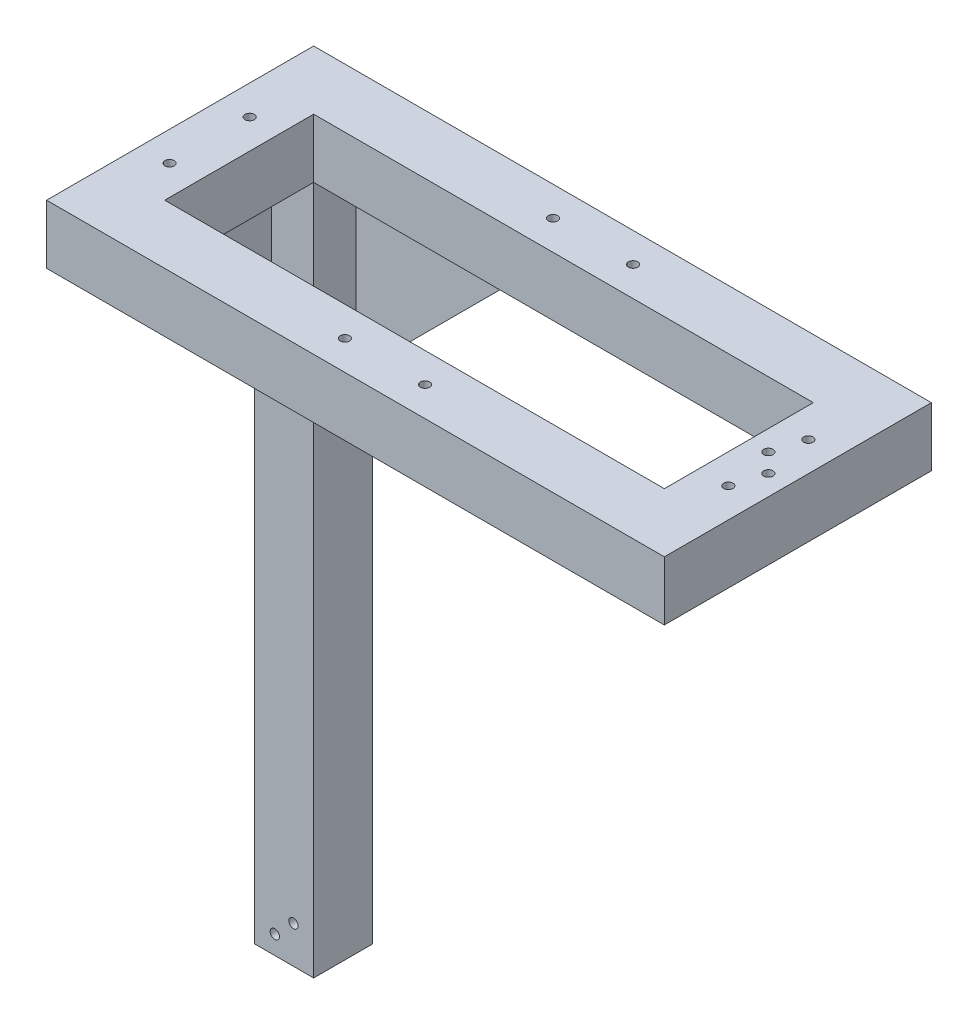
ISO-10303-21;
HEADER;
FILE_DESCRIPTION(('STEP AP214'),'2;1');
FILE_NAME('part.step','',(''),(''),'','','');
FILE_SCHEMA(('AUTOMOTIVE_DESIGN { 1 0 10303 214 1 1 1 1 }'));
ENDSEC;
DATA;
#1=APPLICATION_CONTEXT('core data for automotive mechanical design processes');
#2=APPLICATION_PROTOCOL_DEFINITION('international standard','automotive_design',2000,#1);
#3=PRODUCT_CONTEXT('',#1,'mechanical');
#4=PRODUCT('Part','Part','',(#3));
#5=PRODUCT_RELATED_PRODUCT_CATEGORY('part','',(#4));
#6=PRODUCT_DEFINITION_FORMATION('','',#4);
#7=PRODUCT_DEFINITION_CONTEXT('part definition',#1,'design');
#8=PRODUCT_DEFINITION('design','',#6,#7);
#9=PRODUCT_DEFINITION_SHAPE('','',#8);
#10=(LENGTH_UNIT() NAMED_UNIT(*) SI_UNIT(.MILLI.,.METRE.));
#11=(NAMED_UNIT(*) PLANE_ANGLE_UNIT() SI_UNIT($,.RADIAN.));
#12=(NAMED_UNIT(*) SI_UNIT($,.STERADIAN.) SOLID_ANGLE_UNIT());
#13=UNCERTAINTY_MEASURE_WITH_UNIT(LENGTH_MEASURE(1.E-05),#10,'distance_accuracy_value','');
#14=(GEOMETRIC_REPRESENTATION_CONTEXT(3) GLOBAL_UNCERTAINTY_ASSIGNED_CONTEXT((#13)) GLOBAL_UNIT_ASSIGNED_CONTEXT((#10,
#11,#12)) REPRESENTATION_CONTEXT('',''));
#15=CARTESIAN_POINT('',(0.,0.,0.));
#16=DIRECTION('',(0.,0.,1.));
#17=DIRECTION('',(1.,0.,0.));
#18=AXIS2_PLACEMENT_3D('',#15,#16,#17);
#19=CARTESIAN_POINT('',(-134.15,-100.,-62.7));
#20=DIRECTION('',(-1.,0.,0.));
#21=DIRECTION('',(0.,0.,1.));
#22=AXIS2_PLACEMENT_3D('',#19,#20,#21);
#23=PLANE('',#22);
#24=DIRECTION('',(0.,1.,0.));
#25=VECTOR('',#24,1.);
#26=CARTESIAN_POINT('',(-134.15,-100.,-66.7));
#27=LINE('',#26,#25);
#28=CARTESIAN_POINT('',(-134.15,-100.,-66.7));
#29=VERTEX_POINT('',#28);
#30=CARTESIAN_POINT('',(-134.15,0.,-66.7));
#31=VERTEX_POINT('',#30);
#32=EDGE_CURVE('E96',#29,#31,#27,.T.);
#33=ORIENTED_EDGE('',*,*,#32,.F.);
#34=DIRECTION('',(0.,0.,-1.));
#35=VECTOR('',#34,1.);
#36=CARTESIAN_POINT('',(-134.15,-100.,-62.7));
#37=LINE('',#36,#35);
#38=CARTESIAN_POINT('',(-134.15,-100.,-62.7));
#39=VERTEX_POINT('',#38);
#40=EDGE_CURVE('E12',#39,#29,#37,.T.);
#41=ORIENTED_EDGE('',*,*,#40,.F.);
#42=DIRECTION('',(0.,1.,0.));
#43=VECTOR('',#42,1.);
#44=CARTESIAN_POINT('',(-134.15,-100.,-62.7));
#45=LINE('',#44,#43);
#46=CARTESIAN_POINT('',(-134.15,0.,-62.7));
#47=VERTEX_POINT('',#46);
#48=EDGE_CURVE('E88',#39,#47,#45,.T.);
#49=ORIENTED_EDGE('',*,*,#48,.T.);
#50=DIRECTION('',(0.,0.,-1.));
#51=VECTOR('',#50,1.);
#52=CARTESIAN_POINT('',(-134.15,0.,-62.7));
#53=LINE('',#52,#51);
#54=EDGE_CURVE('E47',#47,#31,#53,.T.);
#55=ORIENTED_EDGE('',*,*,#54,.T.);
#56=EDGE_LOOP('',(#33,#41,#49,#55));
#57=FACE_BOUND('',#56,.T.);
#58=ADVANCED_FACE('F44',(#57),#23,.T.);
#59=CARTESIAN_POINT('',(-34.15,0.,-62.7));
#60=DIRECTION('',(0.707106781186547,-0.707106781186547,0.));
#61=DIRECTION('',(0.707106781186548,0.707106781186548,0.));
#62=AXIS2_PLACEMENT_3D('',#59,#60,#61);
#63=PLANE('',#62);
#64=DIRECTION('',(-0.707106781186547,-0.707106781186547,0.));
#65=VECTOR('',#64,1.);
#66=CARTESIAN_POINT('',(-34.15,0.,-66.7));
#67=LINE('',#66,#65);
#68=CARTESIAN_POINT('',(-34.15,0.,-66.7));
#69=VERTEX_POINT('',#68);
#70=EDGE_CURVE('E90',#69,#29,#67,.T.);
#71=ORIENTED_EDGE('',*,*,#70,.F.);
#72=DIRECTION('',(0.,0.,-1.));
#73=VECTOR('',#72,1.);
#74=CARTESIAN_POINT('',(-34.15,0.,-62.7));
#75=LINE('',#74,#73);
#76=CARTESIAN_POINT('',(-34.15,0.,-62.7));
#77=VERTEX_POINT('',#76);
#78=EDGE_CURVE('E53',#77,#69,#75,.T.);
#79=ORIENTED_EDGE('',*,*,#78,.F.);
#80=DIRECTION('',(-0.707106781186547,-0.707106781186547,0.));
#81=VECTOR('',#80,1.);
#82=CARTESIAN_POINT('',(-34.15,0.,-62.7));
#83=LINE('',#82,#81);
#84=EDGE_CURVE('E85',#77,#39,#83,.T.);
#85=ORIENTED_EDGE('',*,*,#84,.T.);
#86=ORIENTED_EDGE('',*,*,#40,.T.);
#87=EDGE_LOOP('',(#71,#79,#85,#86));
#88=FACE_BOUND('',#87,.T.);
#89=ADVANCED_FACE('F100',(#88),#63,.T.);
#90=CARTESIAN_POINT('',(-134.15,0.,-62.7));
#91=DIRECTION('',(0.,1.,0.));
#92=DIRECTION('',(0.,0.,1.));
#93=AXIS2_PLACEMENT_3D('',#90,#91,#92);
#94=PLANE('',#93);
#95=DIRECTION('',(1.,0.,0.));
#96=VECTOR('',#95,1.);
#97=CARTESIAN_POINT('',(-134.15,0.,-66.7));
#98=LINE('',#97,#96);
#99=EDGE_CURVE('E83',#31,#69,#98,.T.);
#100=ORIENTED_EDGE('',*,*,#99,.F.);
#101=ORIENTED_EDGE('',*,*,#54,.F.);
#102=DIRECTION('',(1.,0.,0.));
#103=VECTOR('',#102,1.);
#104=CARTESIAN_POINT('',(-134.15,0.,-62.7));
#105=LINE('',#104,#103);
#106=EDGE_CURVE('E81',#47,#77,#105,.T.);
#107=ORIENTED_EDGE('',*,*,#106,.T.);
#108=ORIENTED_EDGE('',*,*,#78,.T.);
#109=EDGE_LOOP('',(#100,#101,#107,#108));
#110=FACE_BOUND('',#109,.T.);
#111=ADVANCED_FACE('F80',(#110),#94,.T.);
#112=CARTESIAN_POINT('',(0.,0.,-62.7));
#113=DIRECTION('',(0.,0.,-1.));
#114=DIRECTION('',(-1.,0.,0.));
#115=AXIS2_PLACEMENT_3D('',#112,#113,#114);
#116=PLANE('',#115);
#117=ORIENTED_EDGE('',*,*,#48,.F.);
#118=ORIENTED_EDGE('',*,*,#84,.F.);
#119=ORIENTED_EDGE('',*,*,#106,.F.);
#120=EDGE_LOOP('',(#117,#118,#119));
#121=FACE_BOUND('',#120,.T.);
#122=ADVANCED_FACE('F87',(#121),#116,.F.);
#123=CARTESIAN_POINT('',(0.,0.,-66.7));
#124=DIRECTION('',(0.,0.,-1.));
#125=DIRECTION('',(-1.,0.,0.));
#126=AXIS2_PLACEMENT_3D('',#123,#124,#125);
#127=PLANE('',#126);
#128=ORIENTED_EDGE('',*,*,#32,.T.);
#129=ORIENTED_EDGE('',*,*,#99,.T.);
#130=ORIENTED_EDGE('',*,*,#70,.T.);
#131=EDGE_LOOP('',(#128,#129,#130));
#132=FACE_BOUND('',#131,.T.);
#133=ADVANCED_FACE('F99',(#132),#127,.T.);
#134=CLOSED_SHELL('',(#58,#89,#111,#122,#133));
#135=MANIFOLD_SOLID_BREP('B2',#134);
#136=CARTESIAN_POINT('',(-156.85,-100.,-40.));
#137=DIRECTION('',(0.,0.,1.));
#138=DIRECTION('',(1.,0.,0.));
#139=AXIS2_PLACEMENT_3D('',#136,#137,#138);
#140=PLANE('',#139);
#141=DIRECTION('',(0.,1.,0.));
#142=VECTOR('',#141,1.);
#143=CARTESIAN_POINT('',(-160.85,-100.,-40.));
#144=LINE('',#143,#142);
#145=CARTESIAN_POINT('',(-160.85,-100.,-40.));
#146=VERTEX_POINT('',#145);
#147=CARTESIAN_POINT('',(-160.85,0.,-40.));
#148=VERTEX_POINT('',#147);
#149=EDGE_CURVE('E198',#146,#148,#144,.T.);
#150=ORIENTED_EDGE('',*,*,#149,.T.);
#151=DIRECTION('',(-1.,0.,0.));
#152=VECTOR('',#151,1.);
#153=CARTESIAN_POINT('',(-156.85,0.,-40.));
#154=LINE('',#153,#152);
#155=CARTESIAN_POINT('',(-156.85,0.,-40.));
#156=VERTEX_POINT('',#155);
#157=EDGE_CURVE('E42',#156,#148,#154,.T.);
#158=ORIENTED_EDGE('',*,*,#157,.F.);
#159=DIRECTION('',(0.,1.,0.));
#160=VECTOR('',#159,1.);
#161=CARTESIAN_POINT('',(-156.85,-100.,-40.));
#162=LINE('',#161,#160);
#163=CARTESIAN_POINT('',(-156.85,-100.,-40.));
#164=VERTEX_POINT('',#163);
#165=EDGE_CURVE('E191',#164,#156,#162,.T.);
#166=ORIENTED_EDGE('',*,*,#165,.F.);
#167=DIRECTION('',(-1.,0.,0.));
#168=VECTOR('',#167,1.);
#169=CARTESIAN_POINT('',(-156.85,-100.,-40.));
#170=LINE('',#169,#168);
#171=EDGE_CURVE('E199',#164,#146,#170,.T.);
#172=ORIENTED_EDGE('',*,*,#171,.T.);
#173=EDGE_LOOP('',(#150,#158,#166,#172));
#174=FACE_BOUND('',#173,.T.);
#175=ADVANCED_FACE('F151',(#174),#140,.F.);
#176=CARTESIAN_POINT('',(-156.85,0.,-40.));
#177=DIRECTION('',(0.,-1.,0.));
#178=DIRECTION('',(0.,0.,-1.));
#179=AXIS2_PLACEMENT_3D('',#176,#177,#178);
#180=PLANE('',#179);
#181=DIRECTION('',(0.,0.,1.));
#182=VECTOR('',#181,1.);
#183=CARTESIAN_POINT('',(-160.85,0.,-40.));
#184=LINE('',#183,#182);
#185=CARTESIAN_POINT('',(-160.85,0.,60.));
#186=VERTEX_POINT('',#185);
#187=EDGE_CURVE('E179',#148,#186,#184,.T.);
#188=ORIENTED_EDGE('',*,*,#187,.T.);
#189=DIRECTION('',(-1.,0.,0.));
#190=VECTOR('',#189,1.);
#191=CARTESIAN_POINT('',(-156.85,0.,60.));
#192=LINE('',#191,#190);
#193=CARTESIAN_POINT('',(-156.85,0.,60.));
#194=VERTEX_POINT('',#193);
#195=EDGE_CURVE('E159',#194,#186,#192,.T.);
#196=ORIENTED_EDGE('',*,*,#195,.F.);
#197=DIRECTION('',(0.,0.,1.));
#198=VECTOR('',#197,1.);
#199=CARTESIAN_POINT('',(-156.85,0.,-40.));
#200=LINE('',#199,#198);
#201=EDGE_CURVE('E187',#156,#194,#200,.T.);
#202=ORIENTED_EDGE('',*,*,#201,.F.);
#203=ORIENTED_EDGE('',*,*,#157,.T.);
#204=EDGE_LOOP('',(#188,#196,#202,#203));
#205=FACE_BOUND('',#204,.T.);
#206=ADVANCED_FACE('F188',(#205),#180,.F.);
#207=CARTESIAN_POINT('',(-156.85,0.,60.));
#208=DIRECTION('',(0.,0.707106781186547,-0.707106781186547));
#209=DIRECTION('',(0.,0.707106781186548,0.707106781186548));
#210=AXIS2_PLACEMENT_3D('',#207,#208,#209);
#211=PLANE('',#210);
#212=DIRECTION('',(0.,-0.707106781186547,-0.707106781186547));
#213=VECTOR('',#212,1.);
#214=CARTESIAN_POINT('',(-160.85,0.,60.));
#215=LINE('',#214,#213);
#216=EDGE_CURVE('E184',#186,#146,#215,.T.);
#217=ORIENTED_EDGE('',*,*,#216,.T.);
#218=ORIENTED_EDGE('',*,*,#171,.F.);
#219=DIRECTION('',(0.,-0.707106781186547,-0.707106781186547));
#220=VECTOR('',#219,1.);
#221=CARTESIAN_POINT('',(-156.85,0.,60.));
#222=LINE('',#221,#220);
#223=EDGE_CURVE('E167',#194,#164,#222,.T.);
#224=ORIENTED_EDGE('',*,*,#223,.F.);
#225=ORIENTED_EDGE('',*,*,#195,.T.);
#226=EDGE_LOOP('',(#217,#218,#224,#225));
#227=FACE_BOUND('',#226,.T.);
#228=ADVANCED_FACE('F206',(#227),#211,.F.);
#229=CARTESIAN_POINT('',(-156.85,0.,0.));
#230=DIRECTION('',(1.,0.,0.));
#231=DIRECTION('',(0.,0.,-1.));
#232=AXIS2_PLACEMENT_3D('',#229,#230,#231);
#233=PLANE('',#232);
#234=ORIENTED_EDGE('',*,*,#165,.T.);
#235=ORIENTED_EDGE('',*,*,#201,.T.);
#236=ORIENTED_EDGE('',*,*,#223,.T.);
#237=EDGE_LOOP('',(#234,#235,#236));
#238=FACE_BOUND('',#237,.T.);
#239=ADVANCED_FACE('F194',(#238),#233,.T.);
#240=CARTESIAN_POINT('',(-160.85,0.,0.));
#241=DIRECTION('',(1.,0.,0.));
#242=DIRECTION('',(0.,0.,-1.));
#243=AXIS2_PLACEMENT_3D('',#240,#241,#242);
#244=PLANE('',#243);
#245=ORIENTED_EDGE('',*,*,#149,.F.);
#246=ORIENTED_EDGE('',*,*,#216,.F.);
#247=ORIENTED_EDGE('',*,*,#187,.F.);
#248=EDGE_LOOP('',(#245,#246,#247));
#249=FACE_BOUND('',#248,.T.);
#250=ADVANCED_FACE('F207',(#249),#244,.F.);
#251=CLOSED_SHELL('',(#175,#206,#228,#239,#250));
#252=MANIFOLD_SOLID_BREP('B6',#251);
#253=CARTESIAN_POINT('',(0.,31.7,0.));
#254=DIRECTION('',(0.,1.,0.));
#255=DIRECTION('',(0.,0.,1.));
#256=AXIS2_PLACEMENT_3D('',#253,#254,#255);
#257=PLANE('',#256);
#258=CARTESIAN_POINT('',(-150.,31.7,-21.5));
#259=DIRECTION('',(0.,1.,0.));
#260=DIRECTION('',(0.,0.,1.));
#261=AXIS2_PLACEMENT_3D('',#258,#259,#260);
#262=CIRCLE('',#261,2.5);
#263=CARTESIAN_POINT('',(-150.,31.7,-19.));
#264=VERTEX_POINT('',#263);
#265=EDGE_CURVE('E398',#264,#264,#262,.T.);
#266=ORIENTED_EDGE('',*,*,#265,.F.);
#267=EDGE_LOOP('',(#266));
#268=FACE_BOUND('',#267,.T.);
#269=CARTESIAN_POINT('',(150.,31.7,-21.5));
#270=DIRECTION('',(0.,1.,0.));
#271=DIRECTION('',(0.,0.,1.));
#272=AXIS2_PLACEMENT_3D('',#269,#270,#271);
#273=CIRCLE('',#272,2.5);
#274=CARTESIAN_POINT('',(150.,31.7,-19.));
#275=VERTEX_POINT('',#274);
#276=EDGE_CURVE('E392',#275,#275,#273,.T.);
#277=ORIENTED_EDGE('',*,*,#276,.F.);
#278=EDGE_LOOP('',(#277));
#279=FACE_BOUND('',#278,.T.);
#280=CARTESIAN_POINT('',(150.,31.7,21.5));
#281=DIRECTION('',(0.,1.,0.));
#282=DIRECTION('',(0.,0.,1.));
#283=AXIS2_PLACEMENT_3D('',#280,#281,#282);
#284=CIRCLE('',#283,2.5);
#285=CARTESIAN_POINT('',(150.,31.7,24.));
#286=VERTEX_POINT('',#285);
#287=EDGE_CURVE('E386',#286,#286,#284,.T.);
#288=ORIENTED_EDGE('',*,*,#287,.F.);
#289=EDGE_LOOP('',(#288));
#290=FACE_BOUND('',#289,.T.);
#291=CARTESIAN_POINT('',(155.,31.7,4.99999999999998));
#292=DIRECTION('',(0.,1.,0.));
#293=DIRECTION('',(0.,0.,1.));
#294=AXIS2_PLACEMENT_3D('',#291,#292,#293);
#295=CIRCLE('',#294,2.5);
#296=CARTESIAN_POINT('',(155.,31.7,7.49999999999997));
#297=VERTEX_POINT('',#296);
#298=EDGE_CURVE('E379',#297,#297,#295,.T.);
#299=ORIENTED_EDGE('',*,*,#298,.F.);
#300=EDGE_LOOP('',(#299));
#301=FACE_BOUND('',#300,.T.);
#302=CARTESIAN_POINT('',(-21.5000000000003,31.7,55.8499999999997));
#303=DIRECTION('',(0.,1.,0.));
#304=DIRECTION('',(0.,0.,1.));
#305=AXIS2_PLACEMENT_3D('',#302,#303,#304);
#306=CIRCLE('',#305,2.5);
#307=CARTESIAN_POINT('',(-21.5000000000003,31.7,58.3499999999997));
#308=VERTEX_POINT('',#307);
#309=EDGE_CURVE('E415',#308,#308,#306,.T.);
#310=ORIENTED_EDGE('',*,*,#309,.F.);
#311=EDGE_LOOP('',(#310));
#312=FACE_BOUND('',#311,.T.);
#313=CARTESIAN_POINT('',(21.4999999999997,31.7,-55.85));
#314=DIRECTION('',(0.,1.,0.));
#315=DIRECTION('',(0.,0.,1.));
#316=AXIS2_PLACEMENT_3D('',#313,#314,#315);
#317=CIRCLE('',#316,2.5);
#318=CARTESIAN_POINT('',(21.4999999999997,31.7,-53.35));
#319=VERTEX_POINT('',#318);
#320=EDGE_CURVE('E422',#319,#319,#317,.T.);
#321=ORIENTED_EDGE('',*,*,#320,.F.);
#322=EDGE_LOOP('',(#321));
#323=FACE_BOUND('',#322,.T.);
#324=CARTESIAN_POINT('',(-21.5000000000003,31.7,-55.85));
#325=DIRECTION('',(0.,1.,0.));
#326=DIRECTION('',(0.,0.,1.));
#327=AXIS2_PLACEMENT_3D('',#324,#325,#326);
#328=CIRCLE('',#327,2.5);
#329=CARTESIAN_POINT('',(-21.5000000000003,31.7,-53.35));
#330=VERTEX_POINT('',#329);
#331=EDGE_CURVE('E403',#330,#330,#328,.T.);
#332=ORIENTED_EDGE('',*,*,#331,.F.);
#333=EDGE_LOOP('',(#332));
#334=FACE_BOUND('',#333,.T.);
#335=CARTESIAN_POINT('',(145.,31.7,-5.00000000000002));
#336=DIRECTION('',(0.,1.,0.));
#337=DIRECTION('',(0.,0.,1.));
#338=AXIS2_PLACEMENT_3D('',#335,#336,#337);
#339=CIRCLE('',#338,2.5);
#340=CARTESIAN_POINT('',(145.,31.7,-2.50000000000003));
#341=VERTEX_POINT('',#340);
#342=EDGE_CURVE('E410',#341,#341,#339,.T.);
#343=ORIENTED_EDGE('',*,*,#342,.F.);
#344=EDGE_LOOP('',(#343));
#345=FACE_BOUND('',#344,.T.);
#346=CARTESIAN_POINT('',(-150.,31.7,21.5));
#347=DIRECTION('',(0.,1.,0.));
#348=DIRECTION('',(0.,0.,1.));
#349=AXIS2_PLACEMENT_3D('',#346,#347,#348);
#350=CIRCLE('',#349,2.5);
#351=CARTESIAN_POINT('',(-150.,31.7,24.));
#352=VERTEX_POINT('',#351);
#353=EDGE_CURVE('E373',#352,#352,#350,.T.);
#354=ORIENTED_EDGE('',*,*,#353,.F.);
#355=EDGE_LOOP('',(#354));
#356=FACE_BOUND('',#355,.T.);
#357=CARTESIAN_POINT('',(21.4999999999997,31.7,55.8499999999997));
#358=DIRECTION('',(0.,1.,0.));
#359=DIRECTION('',(0.,0.,1.));
#360=AXIS2_PLACEMENT_3D('',#357,#358,#359);
#361=CIRCLE('',#360,2.5);
#362=CARTESIAN_POINT('',(21.4999999999997,31.7,58.3499999999997));
#363=VERTEX_POINT('',#362);
#364=EDGE_CURVE('E427',#363,#363,#361,.T.);
#365=ORIENTED_EDGE('',*,*,#364,.F.);
#366=EDGE_LOOP('',(#365));
#367=FACE_BOUND('',#366,.T.);
#368=DIRECTION('',(0.,0.,-1.));
#369=VECTOR('',#368,1.);
#370=CARTESIAN_POINT('',(165.85,31.7,-71.7));
#371=LINE('',#370,#369);
#372=CARTESIAN_POINT('',(165.85,31.7,71.7));
#373=VERTEX_POINT('',#372);
#374=CARTESIAN_POINT('',(165.85,31.7,-71.7));
#375=VERTEX_POINT('',#374);
#376=EDGE_CURVE('E459',#373,#375,#371,.T.);
#377=ORIENTED_EDGE('',*,*,#376,.T.);
#378=DIRECTION('',(-1.,0.,0.));
#379=VECTOR('',#378,1.);
#380=CARTESIAN_POINT('',(-165.85,31.7,-71.7));
#381=LINE('',#380,#379);
#382=CARTESIAN_POINT('',(-165.85,31.7,-71.7));
#383=VERTEX_POINT('',#382);
#384=EDGE_CURVE('E462',#375,#383,#381,.T.);
#385=ORIENTED_EDGE('',*,*,#384,.T.);
#386=DIRECTION('',(0.,0.,1.));
#387=VECTOR('',#386,1.);
#388=CARTESIAN_POINT('',(-165.85,31.7,-71.7));
#389=LINE('',#388,#387);
#390=CARTESIAN_POINT('',(-165.85,31.7,71.7));
#391=VERTEX_POINT('',#390);
#392=EDGE_CURVE('E465',#383,#391,#389,.T.);
#393=ORIENTED_EDGE('',*,*,#392,.T.);
#394=DIRECTION('',(1.,0.,0.));
#395=VECTOR('',#394,1.);
#396=CARTESIAN_POINT('',(-165.85,31.7,71.7));
#397=LINE('',#396,#395);
#398=EDGE_CURVE('E467',#391,#373,#397,.T.);
#399=ORIENTED_EDGE('',*,*,#398,.T.);
#400=EDGE_LOOP('',(#377,#385,#393,#399));
#401=FACE_BOUND('',#400,.T.);
#402=DIRECTION('',(-1.,0.,0.));
#403=VECTOR('',#402,1.);
#404=CARTESIAN_POINT('',(-134.15,31.7,-40.));
#405=LINE('',#404,#403);
#406=CARTESIAN_POINT('',(134.15,31.7,-40.));
#407=VERTEX_POINT('',#406);
#408=CARTESIAN_POINT('',(-134.15,31.7,-40.));
#409=VERTEX_POINT('',#408);
#410=EDGE_CURVE('E434',#407,#409,#405,.T.);
#411=ORIENTED_EDGE('',*,*,#410,.F.);
#412=DIRECTION('',(0.,0.,-1.));
#413=VECTOR('',#412,1.);
#414=CARTESIAN_POINT('',(134.15,31.7,-40.));
#415=LINE('',#414,#413);
#416=CARTESIAN_POINT('',(134.15,31.7,40.));
#417=VERTEX_POINT('',#416);
#418=EDGE_CURVE('E432',#417,#407,#415,.T.);
#419=ORIENTED_EDGE('',*,*,#418,.F.);
#420=DIRECTION('',(1.,0.,0.));
#421=VECTOR('',#420,1.);
#422=CARTESIAN_POINT('',(-134.15,31.7,40.));
#423=LINE('',#422,#421);
#424=CARTESIAN_POINT('',(-134.15,31.7,40.));
#425=VERTEX_POINT('',#424);
#426=EDGE_CURVE('E439',#425,#417,#423,.T.);
#427=ORIENTED_EDGE('',*,*,#426,.F.);
#428=DIRECTION('',(0.,0.,1.));
#429=VECTOR('',#428,1.);
#430=CARTESIAN_POINT('',(-134.15,31.7,-40.));
#431=LINE('',#430,#429);
#432=EDGE_CURVE('E437',#409,#425,#431,.T.);
#433=ORIENTED_EDGE('',*,*,#432,.F.);
#434=EDGE_LOOP('',(#411,#419,#427,#433));
#435=FACE_BOUND('',#434,.T.);
#436=ADVANCED_FACE('F249',(#268,#279,#290,#301,#312,#323,#334,#345,#356,#367,#401,#435),#257,.T.);
#437=CARTESIAN_POINT('',(0.,0.,0.));
#438=DIRECTION('',(0.,1.,0.));
#439=DIRECTION('',(0.,0.,1.));
#440=AXIS2_PLACEMENT_3D('',#437,#438,#439);
#441=PLANE('',#440);
#442=CARTESIAN_POINT('',(-150.,0.,-21.5));
#443=DIRECTION('',(0.,1.,0.));
#444=DIRECTION('',(0.,0.,1.));
#445=AXIS2_PLACEMENT_3D('',#442,#443,#444);
#446=CIRCLE('',#445,2.5);
#447=CARTESIAN_POINT('',(-150.,0.,-19.));
#448=VERTEX_POINT('',#447);
#449=EDGE_CURVE('E376',#448,#448,#446,.T.);
#450=ORIENTED_EDGE('',*,*,#449,.T.);
#451=EDGE_LOOP('',(#450));
#452=FACE_BOUND('',#451,.T.);
#453=CARTESIAN_POINT('',(150.,0.,-21.5));
#454=DIRECTION('',(0.,1.,0.));
#455=DIRECTION('',(0.,0.,1.));
#456=AXIS2_PLACEMENT_3D('',#453,#454,#455);
#457=CIRCLE('',#456,2.5);
#458=CARTESIAN_POINT('',(150.,0.,-19.));
#459=VERTEX_POINT('',#458);
#460=EDGE_CURVE('E395',#459,#459,#457,.T.);
#461=ORIENTED_EDGE('',*,*,#460,.T.);
#462=EDGE_LOOP('',(#461));
#463=FACE_BOUND('',#462,.T.);
#464=CARTESIAN_POINT('',(150.,0.,21.5));
#465=DIRECTION('',(0.,1.,0.));
#466=DIRECTION('',(0.,0.,1.));
#467=AXIS2_PLACEMENT_3D('',#464,#465,#466);
#468=CIRCLE('',#467,2.5);
#469=CARTESIAN_POINT('',(150.,0.,24.));
#470=VERTEX_POINT('',#469);
#471=EDGE_CURVE('E389',#470,#470,#468,.T.);
#472=ORIENTED_EDGE('',*,*,#471,.T.);
#473=EDGE_LOOP('',(#472));
#474=FACE_BOUND('',#473,.T.);
#475=CARTESIAN_POINT('',(155.,0.,4.99999999999998));
#476=DIRECTION('',(0.,1.,0.));
#477=DIRECTION('',(0.,0.,1.));
#478=AXIS2_PLACEMENT_3D('',#475,#476,#477);
#479=CIRCLE('',#478,2.5);
#480=CARTESIAN_POINT('',(155.,0.,7.49999999999997));
#481=VERTEX_POINT('',#480);
#482=EDGE_CURVE('E383',#481,#481,#479,.T.);
#483=ORIENTED_EDGE('',*,*,#482,.T.);
#484=EDGE_LOOP('',(#483));
#485=FACE_BOUND('',#484,.T.);
#486=CARTESIAN_POINT('',(-21.5000000000003,0.,55.8499999999997));
#487=DIRECTION('',(0.,1.,0.));
#488=DIRECTION('',(0.,0.,1.));
#489=AXIS2_PLACEMENT_3D('',#486,#487,#488);
#490=CIRCLE('',#489,2.5);
#491=CARTESIAN_POINT('',(-21.5000000000003,0.,58.3499999999997));
#492=VERTEX_POINT('',#491);
#493=EDGE_CURVE('E419',#492,#492,#490,.T.);
#494=ORIENTED_EDGE('',*,*,#493,.T.);
#495=EDGE_LOOP('',(#494));
#496=FACE_BOUND('',#495,.T.);
#497=CARTESIAN_POINT('',(21.4999999999997,0.,-55.85));
#498=DIRECTION('',(0.,1.,0.));
#499=DIRECTION('',(0.,0.,1.));
#500=AXIS2_PLACEMENT_3D('',#497,#498,#499);
#501=CIRCLE('',#500,2.5);
#502=CARTESIAN_POINT('',(21.4999999999997,0.,-53.35));
#503=VERTEX_POINT('',#502);
#504=EDGE_CURVE('E406',#503,#503,#501,.T.);
#505=ORIENTED_EDGE('',*,*,#504,.T.);
#506=EDGE_LOOP('',(#505));
#507=FACE_BOUND('',#506,.T.);
#508=CARTESIAN_POINT('',(-21.5000000000003,0.,-55.85));
#509=DIRECTION('',(0.,1.,0.));
#510=DIRECTION('',(0.,0.,1.));
#511=AXIS2_PLACEMENT_3D('',#508,#509,#510);
#512=CIRCLE('',#511,2.5);
#513=CARTESIAN_POINT('',(-21.5000000000003,0.,-53.35));
#514=VERTEX_POINT('',#513);
#515=EDGE_CURVE('E407',#514,#514,#512,.T.);
#516=ORIENTED_EDGE('',*,*,#515,.T.);
#517=EDGE_LOOP('',(#516));
#518=FACE_BOUND('',#517,.T.);
#519=CARTESIAN_POINT('',(145.,0.,-5.00000000000002));
#520=DIRECTION('',(0.,1.,0.));
#521=DIRECTION('',(0.,0.,1.));
#522=AXIS2_PLACEMENT_3D('',#519,#520,#521);
#523=CIRCLE('',#522,2.5);
#524=CARTESIAN_POINT('',(145.,0.,-2.50000000000003));
#525=VERTEX_POINT('',#524);
#526=EDGE_CURVE('E382',#525,#525,#523,.T.);
#527=ORIENTED_EDGE('',*,*,#526,.T.);
#528=EDGE_LOOP('',(#527));
#529=FACE_BOUND('',#528,.T.);
#530=CARTESIAN_POINT('',(-150.,0.,21.5));
#531=DIRECTION('',(0.,1.,0.));
#532=DIRECTION('',(0.,0.,1.));
#533=AXIS2_PLACEMENT_3D('',#530,#531,#532);
#534=CIRCLE('',#533,2.5);
#535=CARTESIAN_POINT('',(-150.,0.,24.));
#536=VERTEX_POINT('',#535);
#537=EDGE_CURVE('E371',#536,#536,#534,.T.);
#538=ORIENTED_EDGE('',*,*,#537,.T.);
#539=EDGE_LOOP('',(#538));
#540=FACE_BOUND('',#539,.T.);
#541=CARTESIAN_POINT('',(21.4999999999997,0.,55.8499999999997));
#542=DIRECTION('',(0.,1.,0.));
#543=DIRECTION('',(0.,0.,1.));
#544=AXIS2_PLACEMENT_3D('',#541,#542,#543);
#545=CIRCLE('',#544,2.5);
#546=CARTESIAN_POINT('',(21.4999999999997,0.,58.3499999999997));
#547=VERTEX_POINT('',#546);
#548=EDGE_CURVE('E418',#547,#547,#545,.T.);
#549=ORIENTED_EDGE('',*,*,#548,.T.);
#550=EDGE_LOOP('',(#549));
#551=FACE_BOUND('',#550,.T.);
#552=DIRECTION('',(-1.,0.,0.));
#553=VECTOR('',#552,1.);
#554=CARTESIAN_POINT('',(-134.15,0.,-40.));
#555=LINE('',#554,#553);
#556=CARTESIAN_POINT('',(134.15,0.,-40.));
#557=VERTEX_POINT('',#556);
#558=CARTESIAN_POINT('',(-134.15,0.,-40.));
#559=VERTEX_POINT('',#558);
#560=EDGE_CURVE('E443',#557,#559,#555,.T.);
#561=ORIENTED_EDGE('',*,*,#560,.T.);
#562=DIRECTION('',(0.,0.,-1.));
#563=VECTOR('',#562,1.);
#564=CARTESIAN_POINT('',(-134.15,0.,-40.));
#565=LINE('',#564,#563);
#566=CARTESIAN_POINT('',(-134.15,0.,-71.7));
#567=VERTEX_POINT('',#566);
#568=EDGE_CURVE('E361',#559,#567,#565,.T.);
#569=ORIENTED_EDGE('',*,*,#568,.T.);
#570=DIRECTION('',(-1.,0.,0.));
#571=VECTOR('',#570,1.);
#572=CARTESIAN_POINT('',(-165.85,0.,-71.7));
#573=LINE('',#572,#571);
#574=CARTESIAN_POINT('',(165.85,0.,-71.7));
#575=VERTEX_POINT('',#574);
#576=EDGE_CURVE('E338',#575,#567,#573,.T.);
#577=ORIENTED_EDGE('',*,*,#576,.F.);
#578=DIRECTION('',(0.,0.,-1.));
#579=VECTOR('',#578,1.);
#580=CARTESIAN_POINT('',(165.85,0.,-71.7));
#581=LINE('',#580,#579);
#582=CARTESIAN_POINT('',(165.85,0.,71.7));
#583=VERTEX_POINT('',#582);
#584=EDGE_CURVE('E458',#583,#575,#581,.T.);
#585=ORIENTED_EDGE('',*,*,#584,.F.);
#586=DIRECTION('',(1.,0.,0.));
#587=VECTOR('',#586,1.);
#588=CARTESIAN_POINT('',(-165.85,0.,71.7));
#589=LINE('',#588,#587);
#590=CARTESIAN_POINT('',(-165.85,0.,71.7));
#591=VERTEX_POINT('',#590);
#592=EDGE_CURVE('E463',#591,#583,#589,.T.);
#593=ORIENTED_EDGE('',*,*,#592,.F.);
#594=DIRECTION('',(0.,0.,1.));
#595=VECTOR('',#594,1.);
#596=CARTESIAN_POINT('',(-165.85,0.,-71.7));
#597=LINE('',#596,#595);
#598=CARTESIAN_POINT('',(-165.85,0.,-40.));
#599=VERTEX_POINT('',#598);
#600=EDGE_CURVE('E473',#599,#591,#597,.T.);
#601=ORIENTED_EDGE('',*,*,#600,.F.);
#602=DIRECTION('',(1.,0.,0.));
#603=VECTOR('',#602,1.);
#604=CARTESIAN_POINT('',(-134.15,0.,-40.));
#605=LINE('',#604,#603);
#606=EDGE_CURVE('E358',#599,#559,#605,.T.);
#607=ORIENTED_EDGE('',*,*,#606,.T.);
#608=DIRECTION('',(0.,0.,1.));
#609=VECTOR('',#608,1.);
#610=CARTESIAN_POINT('',(-134.15,0.,-40.));
#611=LINE('',#610,#609);
#612=CARTESIAN_POINT('',(-134.15,0.,40.));
#613=VERTEX_POINT('',#612);
#614=EDGE_CURVE('E446',#559,#613,#611,.T.);
#615=ORIENTED_EDGE('',*,*,#614,.T.);
#616=DIRECTION('',(1.,0.,0.));
#617=VECTOR('',#616,1.);
#618=CARTESIAN_POINT('',(-134.15,0.,40.));
#619=LINE('',#618,#617);
#620=CARTESIAN_POINT('',(134.15,0.,40.));
#621=VERTEX_POINT('',#620);
#622=EDGE_CURVE('E435',#613,#621,#619,.T.);
#623=ORIENTED_EDGE('',*,*,#622,.T.);
#624=DIRECTION('',(0.,0.,-1.));
#625=VECTOR('',#624,1.);
#626=CARTESIAN_POINT('',(134.15,0.,-40.));
#627=LINE('',#626,#625);
#628=EDGE_CURVE('E274',#621,#557,#627,.T.);
#629=ORIENTED_EDGE('',*,*,#628,.T.);
#630=EDGE_LOOP('',(#561,#569,#577,#585,#593,#601,#607,#615,#623,#629));
#631=FACE_BOUND('',#630,.T.);
#632=ADVANCED_FACE('F507',(#452,#463,#474,#485,#496,#507,#518,#529,#540,#551,#631),#441,.F.);
#633=CARTESIAN_POINT('',(165.85,31.7,-71.7));
#634=DIRECTION('',(-1.,0.,0.));
#635=DIRECTION('',(0.,0.,1.));
#636=AXIS2_PLACEMENT_3D('',#633,#634,#635);
#637=PLANE('',#636);
#638=ORIENTED_EDGE('',*,*,#584,.T.);
#639=DIRECTION('',(0.,-1.,0.));
#640=VECTOR('',#639,1.);
#641=CARTESIAN_POINT('',(165.85,31.7,-71.7));
#642=LINE('',#641,#640);
#643=EDGE_CURVE('E149',#375,#575,#642,.T.);
#644=ORIENTED_EDGE('',*,*,#643,.F.);
#645=ORIENTED_EDGE('',*,*,#376,.F.);
#646=DIRECTION('',(0.,-1.,0.));
#647=VECTOR('',#646,1.);
#648=CARTESIAN_POINT('',(165.85,31.7,71.7));
#649=LINE('',#648,#647);
#650=EDGE_CURVE('E469',#373,#583,#649,.T.);
#651=ORIENTED_EDGE('',*,*,#650,.T.);
#652=EDGE_LOOP('',(#638,#644,#645,#651));
#653=FACE_BOUND('',#652,.T.);
#654=ADVANCED_FACE('F251',(#653),#637,.F.);
#655=CARTESIAN_POINT('',(-165.85,31.7,-71.7));
#656=DIRECTION('',(0.,0.,1.));
#657=DIRECTION('',(1.,0.,0.));
#658=AXIS2_PLACEMENT_3D('',#655,#656,#657);
#659=PLANE('',#658);
#660=CARTESIAN_POINT('',(-155.,-360.,-71.7));
#661=DIRECTION('',(0.,0.,1.));
#662=DIRECTION('',(1.,0.,0.));
#663=AXIS2_PLACEMENT_3D('',#660,#661,#662);
#664=CIRCLE('',#663,2.5);
#665=CARTESIAN_POINT('',(-152.5,-360.,-71.7));
#666=VERTEX_POINT('',#665);
#667=EDGE_CURVE('E483',#666,#666,#664,.T.);
#668=ORIENTED_EDGE('',*,*,#667,.T.);
#669=EDGE_LOOP('',(#668));
#670=FACE_BOUND('',#669,.T.);
#671=CARTESIAN_POINT('',(-145.,-350.,-71.7));
#672=DIRECTION('',(0.,0.,1.));
#673=DIRECTION('',(1.,0.,0.));
#674=AXIS2_PLACEMENT_3D('',#671,#672,#673);
#675=CIRCLE('',#674,2.5);
#676=CARTESIAN_POINT('',(-142.5,-350.,-71.7));
#677=VERTEX_POINT('',#676);
#678=EDGE_CURVE('E364',#677,#677,#675,.T.);
#679=ORIENTED_EDGE('',*,*,#678,.T.);
#680=EDGE_LOOP('',(#679));
#681=FACE_BOUND('',#680,.T.);
#682=ORIENTED_EDGE('',*,*,#576,.T.);
#683=DIRECTION('',(0.,1.,0.));
#684=VECTOR('',#683,1.);
#685=CARTESIAN_POINT('',(-134.15,-370.,-71.7));
#686=LINE('',#685,#684);
#687=CARTESIAN_POINT('',(-134.15,-370.,-71.7));
#688=VERTEX_POINT('',#687);
#689=EDGE_CURVE('E333',#688,#567,#686,.T.);
#690=ORIENTED_EDGE('',*,*,#689,.F.);
#691=DIRECTION('',(-1.,0.,0.));
#692=VECTOR('',#691,1.);
#693=CARTESIAN_POINT('',(-134.15,-370.,-71.7));
#694=LINE('',#693,#692);
#695=CARTESIAN_POINT('',(-165.85,-370.,-71.7));
#696=VERTEX_POINT('',#695);
#697=EDGE_CURVE('E337',#688,#696,#694,.T.);
#698=ORIENTED_EDGE('',*,*,#697,.T.);
#699=DIRECTION('',(0.,-1.,0.));
#700=VECTOR('',#699,1.);
#701=CARTESIAN_POINT('',(-165.85,31.7,-71.7));
#702=LINE('',#701,#700);
#703=EDGE_CURVE('E258',#383,#696,#702,.T.);
#704=ORIENTED_EDGE('',*,*,#703,.F.);
#705=ORIENTED_EDGE('',*,*,#384,.F.);
#706=ORIENTED_EDGE('',*,*,#643,.T.);
#707=EDGE_LOOP('',(#682,#690,#698,#704,#705,#706));
#708=FACE_BOUND('',#707,.T.);
#709=ADVANCED_FACE('F335',(#670,#681,#708),#659,.F.);
#710=CARTESIAN_POINT('',(-165.85,31.7,-71.7));
#711=DIRECTION('',(1.,0.,0.));
#712=DIRECTION('',(0.,0.,-1.));
#713=AXIS2_PLACEMENT_3D('',#710,#711,#712);
#714=PLANE('',#713);
#715=ORIENTED_EDGE('',*,*,#703,.T.);
#716=DIRECTION('',(0.,0.,1.));
#717=VECTOR('',#716,1.);
#718=CARTESIAN_POINT('',(-165.85,-370.,-40.));
#719=LINE('',#718,#717);
#720=CARTESIAN_POINT('',(-165.85,-370.,-40.));
#721=VERTEX_POINT('',#720);
#722=EDGE_CURVE('E353',#696,#721,#719,.T.);
#723=ORIENTED_EDGE('',*,*,#722,.T.);
#724=DIRECTION('',(0.,1.,0.));
#725=VECTOR('',#724,1.);
#726=CARTESIAN_POINT('',(-165.85,-370.,-40.));
#727=LINE('',#726,#725);
#728=EDGE_CURVE('E342',#721,#599,#727,.T.);
#729=ORIENTED_EDGE('',*,*,#728,.T.);
#730=ORIENTED_EDGE('',*,*,#600,.T.);
#731=DIRECTION('',(0.,-1.,0.));
#732=VECTOR('',#731,1.);
#733=CARTESIAN_POINT('',(-165.85,31.7,71.7));
#734=LINE('',#733,#732);
#735=EDGE_CURVE('E478',#391,#591,#734,.T.);
#736=ORIENTED_EDGE('',*,*,#735,.F.);
#737=ORIENTED_EDGE('',*,*,#392,.F.);
#738=EDGE_LOOP('',(#715,#723,#729,#730,#736,#737));
#739=FACE_BOUND('',#738,.T.);
#740=ADVANCED_FACE('F525',(#739),#714,.F.);
#741=CARTESIAN_POINT('',(-165.85,31.7,71.7));
#742=DIRECTION('',(0.,0.,-1.));
#743=DIRECTION('',(-1.,0.,0.));
#744=AXIS2_PLACEMENT_3D('',#741,#742,#743);
#745=PLANE('',#744);
#746=ORIENTED_EDGE('',*,*,#592,.T.);
#747=ORIENTED_EDGE('',*,*,#650,.F.);
#748=ORIENTED_EDGE('',*,*,#398,.F.);
#749=ORIENTED_EDGE('',*,*,#735,.T.);
#750=EDGE_LOOP('',(#746,#747,#748,#749));
#751=FACE_BOUND('',#750,.T.);
#752=ADVANCED_FACE('F522',(#751),#745,.F.);
#753=CARTESIAN_POINT('',(134.15,31.7,-40.));
#754=DIRECTION('',(-1.,0.,0.));
#755=DIRECTION('',(0.,0.,1.));
#756=AXIS2_PLACEMENT_3D('',#753,#754,#755);
#757=PLANE('',#756);
#758=ORIENTED_EDGE('',*,*,#628,.F.);
#759=DIRECTION('',(0.,-1.,0.));
#760=VECTOR('',#759,1.);
#761=CARTESIAN_POINT('',(134.15,31.7,40.));
#762=LINE('',#761,#760);
#763=EDGE_CURVE('E441',#417,#621,#762,.T.);
#764=ORIENTED_EDGE('',*,*,#763,.F.);
#765=ORIENTED_EDGE('',*,*,#418,.T.);
#766=DIRECTION('',(0.,-1.,0.));
#767=VECTOR('',#766,1.);
#768=CARTESIAN_POINT('',(134.15,31.7,-40.));
#769=LINE('',#768,#767);
#770=EDGE_CURVE('E456',#407,#557,#769,.T.);
#771=ORIENTED_EDGE('',*,*,#770,.T.);
#772=EDGE_LOOP('',(#758,#764,#765,#771));
#773=FACE_BOUND('',#772,.T.);
#774=ADVANCED_FACE('F519',(#773),#757,.T.);
#775=CARTESIAN_POINT('',(-134.15,31.7,-40.));
#776=DIRECTION('',(0.,0.,1.));
#777=DIRECTION('',(1.,0.,0.));
#778=AXIS2_PLACEMENT_3D('',#775,#776,#777);
#779=PLANE('',#778);
#780=ORIENTED_EDGE('',*,*,#560,.F.);
#781=ORIENTED_EDGE('',*,*,#770,.F.);
#782=ORIENTED_EDGE('',*,*,#410,.T.);
#783=DIRECTION('',(0.,-1.,0.));
#784=VECTOR('',#783,1.);
#785=CARTESIAN_POINT('',(-134.15,31.7,-40.));
#786=LINE('',#785,#784);
#787=EDGE_CURVE('E453',#409,#559,#786,.T.);
#788=ORIENTED_EDGE('',*,*,#787,.T.);
#789=EDGE_LOOP('',(#780,#781,#782,#788));
#790=FACE_BOUND('',#789,.T.);
#791=ADVANCED_FACE('F554',(#790),#779,.T.);
#792=CARTESIAN_POINT('',(-134.15,31.7,-40.));
#793=DIRECTION('',(1.,0.,0.));
#794=DIRECTION('',(0.,0.,-1.));
#795=AXIS2_PLACEMENT_3D('',#792,#793,#794);
#796=PLANE('',#795);
#797=ORIENTED_EDGE('',*,*,#614,.F.);
#798=ORIENTED_EDGE('',*,*,#787,.F.);
#799=ORIENTED_EDGE('',*,*,#432,.T.);
#800=DIRECTION('',(0.,-1.,0.));
#801=VECTOR('',#800,1.);
#802=CARTESIAN_POINT('',(-134.15,31.7,40.));
#803=LINE('',#802,#801);
#804=EDGE_CURVE('E266',#425,#613,#803,.T.);
#805=ORIENTED_EDGE('',*,*,#804,.T.);
#806=EDGE_LOOP('',(#797,#798,#799,#805));
#807=FACE_BOUND('',#806,.T.);
#808=ADVANCED_FACE('F559',(#807),#796,.T.);
#809=CARTESIAN_POINT('',(-134.15,31.7,40.));
#810=DIRECTION('',(0.,0.,-1.));
#811=DIRECTION('',(-1.,0.,0.));
#812=AXIS2_PLACEMENT_3D('',#809,#810,#811);
#813=PLANE('',#812);
#814=ORIENTED_EDGE('',*,*,#622,.F.);
#815=ORIENTED_EDGE('',*,*,#804,.F.);
#816=ORIENTED_EDGE('',*,*,#426,.T.);
#817=ORIENTED_EDGE('',*,*,#763,.T.);
#818=EDGE_LOOP('',(#814,#815,#816,#817));
#819=FACE_BOUND('',#818,.T.);
#820=ADVANCED_FACE('F560',(#819),#813,.T.);
#821=CARTESIAN_POINT('',(21.4999999999997,31.7,55.8499999999997));
#822=DIRECTION('',(0.,-1.,0.));
#823=DIRECTION('',(0.,0.,-1.));
#824=AXIS2_PLACEMENT_3D('',#821,#822,#823);
#825=CYLINDRICAL_SURFACE('',#824,2.5);
#826=ORIENTED_EDGE('',*,*,#364,.T.);
#827=EDGE_LOOP('',(#826));
#828=FACE_BOUND('',#827,.T.);
#829=ORIENTED_EDGE('',*,*,#548,.F.);
#830=EDGE_LOOP('',(#829));
#831=FACE_BOUND('',#830,.T.);
#832=ADVANCED_FACE('F575',(#828,#831),#825,.F.);
#833=CARTESIAN_POINT('',(-150.,31.7,21.5));
#834=DIRECTION('',(0.,-1.,0.));
#835=DIRECTION('',(0.,0.,-1.));
#836=AXIS2_PLACEMENT_3D('',#833,#834,#835);
#837=CYLINDRICAL_SURFACE('',#836,2.5);
#838=ORIENTED_EDGE('',*,*,#353,.T.);
#839=EDGE_LOOP('',(#838));
#840=FACE_BOUND('',#839,.T.);
#841=ORIENTED_EDGE('',*,*,#537,.F.);
#842=EDGE_LOOP('',(#841));
#843=FACE_BOUND('',#842,.T.);
#844=ADVANCED_FACE('F578',(#840,#843),#837,.F.);
#845=CARTESIAN_POINT('',(145.,31.7,-5.00000000000002));
#846=DIRECTION('',(0.,-1.,0.));
#847=DIRECTION('',(0.,0.,-1.));
#848=AXIS2_PLACEMENT_3D('',#845,#846,#847);
#849=CYLINDRICAL_SURFACE('',#848,2.5);
#850=ORIENTED_EDGE('',*,*,#342,.T.);
#851=EDGE_LOOP('',(#850));
#852=FACE_BOUND('',#851,.T.);
#853=ORIENTED_EDGE('',*,*,#526,.F.);
#854=EDGE_LOOP('',(#853));
#855=FACE_BOUND('',#854,.T.);
#856=ADVANCED_FACE('F590',(#852,#855),#849,.F.);
#857=CARTESIAN_POINT('',(-21.5000000000003,31.7,-55.85));
#858=DIRECTION('',(0.,-1.,0.));
#859=DIRECTION('',(0.,0.,-1.));
#860=AXIS2_PLACEMENT_3D('',#857,#858,#859);
#861=CYLINDRICAL_SURFACE('',#860,2.5);
#862=ORIENTED_EDGE('',*,*,#331,.T.);
#863=EDGE_LOOP('',(#862));
#864=FACE_BOUND('',#863,.T.);
#865=ORIENTED_EDGE('',*,*,#515,.F.);
#866=EDGE_LOOP('',(#865));
#867=FACE_BOUND('',#866,.T.);
#868=ADVANCED_FACE('F584',(#864,#867),#861,.F.);
#869=CARTESIAN_POINT('',(21.4999999999997,31.7,-55.85));
#870=DIRECTION('',(0.,-1.,0.));
#871=DIRECTION('',(0.,0.,-1.));
#872=AXIS2_PLACEMENT_3D('',#869,#870,#871);
#873=CYLINDRICAL_SURFACE('',#872,2.5);
#874=ORIENTED_EDGE('',*,*,#320,.T.);
#875=EDGE_LOOP('',(#874));
#876=FACE_BOUND('',#875,.T.);
#877=ORIENTED_EDGE('',*,*,#504,.F.);
#878=EDGE_LOOP('',(#877));
#879=FACE_BOUND('',#878,.T.);
#880=ADVANCED_FACE('F580',(#876,#879),#873,.F.);
#881=CARTESIAN_POINT('',(-21.5000000000003,31.7,55.8499999999997));
#882=DIRECTION('',(0.,-1.,0.));
#883=DIRECTION('',(0.,0.,-1.));
#884=AXIS2_PLACEMENT_3D('',#881,#882,#883);
#885=CYLINDRICAL_SURFACE('',#884,2.5);
#886=ORIENTED_EDGE('',*,*,#309,.T.);
#887=EDGE_LOOP('',(#886));
#888=FACE_BOUND('',#887,.T.);
#889=ORIENTED_EDGE('',*,*,#493,.F.);
#890=EDGE_LOOP('',(#889));
#891=FACE_BOUND('',#890,.T.);
#892=ADVANCED_FACE('F583',(#888,#891),#885,.F.);
#893=CARTESIAN_POINT('',(155.,31.7,4.99999999999998));
#894=DIRECTION('',(0.,-1.,0.));
#895=DIRECTION('',(0.,0.,-1.));
#896=AXIS2_PLACEMENT_3D('',#893,#894,#895);
#897=CYLINDRICAL_SURFACE('',#896,2.5);
#898=ORIENTED_EDGE('',*,*,#298,.T.);
#899=EDGE_LOOP('',(#898));
#900=FACE_BOUND('',#899,.T.);
#901=ORIENTED_EDGE('',*,*,#482,.F.);
#902=EDGE_LOOP('',(#901));
#903=FACE_BOUND('',#902,.T.);
#904=ADVANCED_FACE('F588',(#900,#903),#897,.F.);
#905=CARTESIAN_POINT('',(150.,31.7,21.5));
#906=DIRECTION('',(0.,-1.,0.));
#907=DIRECTION('',(0.,0.,-1.));
#908=AXIS2_PLACEMENT_3D('',#905,#906,#907);
#909=CYLINDRICAL_SURFACE('',#908,2.5);
#910=ORIENTED_EDGE('',*,*,#287,.T.);
#911=EDGE_LOOP('',(#910));
#912=FACE_BOUND('',#911,.T.);
#913=ORIENTED_EDGE('',*,*,#471,.F.);
#914=EDGE_LOOP('',(#913));
#915=FACE_BOUND('',#914,.T.);
#916=ADVANCED_FACE('F603',(#912,#915),#909,.F.);
#917=CARTESIAN_POINT('',(150.,31.7,-21.5));
#918=DIRECTION('',(0.,-1.,0.));
#919=DIRECTION('',(0.,0.,-1.));
#920=AXIS2_PLACEMENT_3D('',#917,#918,#919);
#921=CYLINDRICAL_SURFACE('',#920,2.5);
#922=ORIENTED_EDGE('',*,*,#276,.T.);
#923=EDGE_LOOP('',(#922));
#924=FACE_BOUND('',#923,.T.);
#925=ORIENTED_EDGE('',*,*,#460,.F.);
#926=EDGE_LOOP('',(#925));
#927=FACE_BOUND('',#926,.T.);
#928=ADVANCED_FACE('F599',(#924,#927),#921,.F.);
#929=CARTESIAN_POINT('',(-150.,31.7,-21.5));
#930=DIRECTION('',(0.,-1.,0.));
#931=DIRECTION('',(0.,0.,-1.));
#932=AXIS2_PLACEMENT_3D('',#929,#930,#931);
#933=CYLINDRICAL_SURFACE('',#932,2.5);
#934=ORIENTED_EDGE('',*,*,#265,.T.);
#935=EDGE_LOOP('',(#934));
#936=FACE_BOUND('',#935,.T.);
#937=ORIENTED_EDGE('',*,*,#449,.F.);
#938=EDGE_LOOP('',(#937));
#939=FACE_BOUND('',#938,.T.);
#940=ADVANCED_FACE('F597',(#936,#939),#933,.F.);
#941=CARTESIAN_POINT('',(-134.15,-370.,-40.));
#942=DIRECTION('',(1.,0.,0.));
#943=DIRECTION('',(0.,0.,-1.));
#944=AXIS2_PLACEMENT_3D('',#941,#942,#943);
#945=PLANE('',#944);
#946=ORIENTED_EDGE('',*,*,#568,.F.);
#947=DIRECTION('',(0.,1.,0.));
#948=VECTOR('',#947,1.);
#949=CARTESIAN_POINT('',(-134.15,-370.,-40.));
#950=LINE('',#949,#948);
#951=CARTESIAN_POINT('',(-134.15,-370.,-40.));
#952=VERTEX_POINT('',#951);
#953=EDGE_CURVE('E357',#952,#559,#950,.T.);
#954=ORIENTED_EDGE('',*,*,#953,.F.);
#955=DIRECTION('',(0.,0.,-1.));
#956=VECTOR('',#955,1.);
#957=CARTESIAN_POINT('',(-134.15,-370.,-40.));
#958=LINE('',#957,#956);
#959=EDGE_CURVE('E350',#952,#688,#958,.T.);
#960=ORIENTED_EDGE('',*,*,#959,.T.);
#961=ORIENTED_EDGE('',*,*,#689,.T.);
#962=EDGE_LOOP('',(#946,#954,#960,#961));
#963=FACE_BOUND('',#962,.T.);
#964=ADVANCED_FACE('F355',(#963),#945,.T.);
#965=CARTESIAN_POINT('',(-134.15,-370.,-40.));
#966=DIRECTION('',(0.,0.,1.));
#967=DIRECTION('',(1.,0.,0.));
#968=AXIS2_PLACEMENT_3D('',#965,#966,#967);
#969=PLANE('',#968);
#970=CARTESIAN_POINT('',(-155.,-360.,-40.));
#971=DIRECTION('',(0.,0.,1.));
#972=DIRECTION('',(1.,0.,0.));
#973=AXIS2_PLACEMENT_3D('',#970,#971,#972);
#974=CIRCLE('',#973,2.5);
#975=CARTESIAN_POINT('',(-152.5,-360.,-40.));
#976=VERTEX_POINT('',#975);
#977=EDGE_CURVE('E253',#976,#976,#974,.T.);
#978=ORIENTED_EDGE('',*,*,#977,.F.);
#979=EDGE_LOOP('',(#978));
#980=FACE_BOUND('',#979,.T.);
#981=CARTESIAN_POINT('',(-145.,-350.,-40.));
#982=DIRECTION('',(0.,0.,1.));
#983=DIRECTION('',(1.,0.,0.));
#984=AXIS2_PLACEMENT_3D('',#981,#982,#983);
#985=CIRCLE('',#984,2.5);
#986=CARTESIAN_POINT('',(-142.5,-350.,-40.));
#987=VERTEX_POINT('',#986);
#988=EDGE_CURVE('E481',#987,#987,#985,.T.);
#989=ORIENTED_EDGE('',*,*,#988,.F.);
#990=EDGE_LOOP('',(#989));
#991=FACE_BOUND('',#990,.T.);
#992=ORIENTED_EDGE('',*,*,#606,.F.);
#993=ORIENTED_EDGE('',*,*,#728,.F.);
#994=DIRECTION('',(1.,0.,0.));
#995=VECTOR('',#994,1.);
#996=CARTESIAN_POINT('',(-134.15,-370.,-40.));
#997=LINE('',#996,#995);
#998=EDGE_CURVE('E343',#721,#952,#997,.T.);
#999=ORIENTED_EDGE('',*,*,#998,.T.);
#1000=ORIENTED_EDGE('',*,*,#953,.T.);
#1001=EDGE_LOOP('',(#992,#993,#999,#1000));
#1002=FACE_BOUND('',#1001,.T.);
#1003=ADVANCED_FACE('F504',(#980,#991,#1002),#969,.T.);
#1004=CARTESIAN_POINT('',(0.,-370.,0.));
#1005=DIRECTION('',(0.,1.,0.));
#1006=DIRECTION('',(0.,0.,1.));
#1007=AXIS2_PLACEMENT_3D('',#1004,#1005,#1006);
#1008=PLANE('',#1007);
#1009=ORIENTED_EDGE('',*,*,#959,.F.);
#1010=ORIENTED_EDGE('',*,*,#998,.F.);
#1011=ORIENTED_EDGE('',*,*,#722,.F.);
#1012=ORIENTED_EDGE('',*,*,#697,.F.);
#1013=EDGE_LOOP('',(#1009,#1010,#1011,#1012));
#1014=FACE_BOUND('',#1013,.T.);
#1015=ADVANCED_FACE('F348',(#1014),#1008,.F.);
#1016=CARTESIAN_POINT('',(-145.,-350.,-71.7));
#1017=DIRECTION('',(0.,0.,1.));
#1018=DIRECTION('',(1.,0.,0.));
#1019=AXIS2_PLACEMENT_3D('',#1016,#1017,#1018);
#1020=CYLINDRICAL_SURFACE('',#1019,2.5);
#1021=ORIENTED_EDGE('',*,*,#988,.T.);
#1022=EDGE_LOOP('',(#1021));
#1023=FACE_BOUND('',#1022,.T.);
#1024=ORIENTED_EDGE('',*,*,#678,.F.);
#1025=EDGE_LOOP('',(#1024));
#1026=FACE_BOUND('',#1025,.T.);
#1027=ADVANCED_FACE('F494',(#1023,#1026),#1020,.F.);
#1028=CARTESIAN_POINT('',(-155.,-360.,-71.7));
#1029=DIRECTION('',(0.,0.,1.));
#1030=DIRECTION('',(1.,0.,0.));
#1031=AXIS2_PLACEMENT_3D('',#1028,#1029,#1030);
#1032=CYLINDRICAL_SURFACE('',#1031,2.5);
#1033=ORIENTED_EDGE('',*,*,#977,.T.);
#1034=EDGE_LOOP('',(#1033));
#1035=FACE_BOUND('',#1034,.T.);
#1036=ORIENTED_EDGE('',*,*,#667,.F.);
#1037=EDGE_LOOP('',(#1036));
#1038=FACE_BOUND('',#1037,.T.);
#1039=ADVANCED_FACE('F496',(#1035,#1038),#1032,.F.);
#1040=CLOSED_SHELL('',(#436,#632,#654,#709,#740,#752,#774,#791,#808,#820,#832,#844,#856,#868,
#880,#892,#904,#916,#928,#940,#964,#1003,#1015,#1027,#1039));
#1041=MANIFOLD_SOLID_BREP('B36',#1040);
#1042=ADVANCED_BREP_SHAPE_REPRESENTATION('',(#18,#135,#252,#1041),#14);
#1043=SHAPE_DEFINITION_REPRESENTATION(#9,#1042);
ENDSEC;
END-ISO-10303-21;
